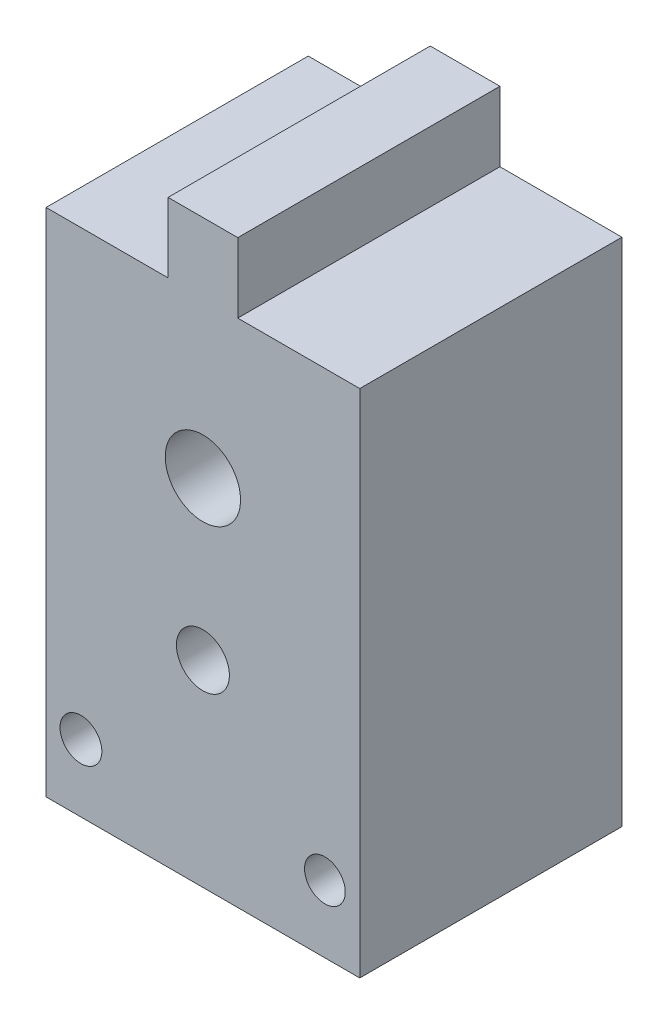
ISO-10303-21;
HEADER;
FILE_DESCRIPTION(('STEP AP214'),'2;1');
FILE_NAME('part.step','',(''),(''),'','','');
FILE_SCHEMA(('AUTOMOTIVE_DESIGN { 1 0 10303 214 1 1 1 1 }'));
ENDSEC;
DATA;
#1=APPLICATION_CONTEXT('core data for automotive mechanical design processes');
#2=APPLICATION_PROTOCOL_DEFINITION('international standard','automotive_design',2000,#1);
#3=PRODUCT_CONTEXT('',#1,'mechanical');
#4=PRODUCT('Part','Part','',(#3));
#5=PRODUCT_RELATED_PRODUCT_CATEGORY('part','',(#4));
#6=PRODUCT_DEFINITION_FORMATION('','',#4);
#7=PRODUCT_DEFINITION_CONTEXT('part definition',#1,'design');
#8=PRODUCT_DEFINITION('design','',#6,#7);
#9=PRODUCT_DEFINITION_SHAPE('','',#8);
#10=(LENGTH_UNIT() NAMED_UNIT(*) SI_UNIT(.MILLI.,.METRE.));
#11=(NAMED_UNIT(*) PLANE_ANGLE_UNIT() SI_UNIT($,.RADIAN.));
#12=(NAMED_UNIT(*) SI_UNIT($,.STERADIAN.) SOLID_ANGLE_UNIT());
#13=UNCERTAINTY_MEASURE_WITH_UNIT(LENGTH_MEASURE(1.E-05),#10,'distance_accuracy_value','');
#14=(GEOMETRIC_REPRESENTATION_CONTEXT(3) GLOBAL_UNCERTAINTY_ASSIGNED_CONTEXT((#13)) GLOBAL_UNIT_ASSIGNED_CONTEXT((#10,
#11,#12)) REPRESENTATION_CONTEXT('',''));
#15=CARTESIAN_POINT('',(0.,0.,0.));
#16=DIRECTION('',(0.,0.,1.));
#17=DIRECTION('',(1.,0.,0.));
#18=AXIS2_PLACEMENT_3D('',#15,#16,#17);
#19=CARTESIAN_POINT('',(0.,0.,9.3865));
#20=DIRECTION('',(0.,0.,-1.));
#21=DIRECTION('',(-1.,0.,0.));
#22=AXIS2_PLACEMENT_3D('',#19,#20,#21);
#23=PLANE('',#22);
#24=DIRECTION('',(0.,-1.,0.));
#25=VECTOR('',#24,1.);
#26=CARTESIAN_POINT('',(-2.49571428571429,20.7724059204904,9.3865));
#27=LINE('',#26,#25);
#28=CARTESIAN_POINT('',(-2.49571428571429,20.7724059204904,9.3865));
#29=VERTEX_POINT('',#28);
#30=CARTESIAN_POINT('',(-2.49571428571429,15.7809773490619,9.3865));
#31=VERTEX_POINT('',#30);
#32=EDGE_CURVE('E145',#29,#31,#27,.T.);
#33=ORIENTED_EDGE('',*,*,#32,.T.);
#34=DIRECTION('',(-1.,0.,0.));
#35=VECTOR('',#34,1.);
#36=CARTESIAN_POINT('',(-2.49571428571429,15.7809773490619,9.3865));
#37=LINE('',#36,#35);
#38=CARTESIAN_POINT('',(-11.2307142857143,15.7809773490619,9.3865));
#39=VERTEX_POINT('',#38);
#40=EDGE_CURVE('E93',#31,#39,#37,.T.);
#41=ORIENTED_EDGE('',*,*,#40,.T.);
#42=DIRECTION('',(0.,-1.,0.));
#43=VECTOR('',#42,1.);
#44=CARTESIAN_POINT('',(-11.2307142857143,15.7809773490619,9.3865));
#45=LINE('',#44,#43);
#46=CARTESIAN_POINT('',(-11.2307142857143,-20.7724059204904,9.3865));
#47=VERTEX_POINT('',#46);
#48=EDGE_CURVE('E160',#39,#47,#45,.T.);
#49=ORIENTED_EDGE('',*,*,#48,.T.);
#50=DIRECTION('',(1.,0.,0.));
#51=VECTOR('',#50,1.);
#52=CARTESIAN_POINT('',(-11.2307142857143,-20.7724059204904,9.3865));
#53=LINE('',#52,#51);
#54=CARTESIAN_POINT('',(11.2307142857143,-20.7724059204904,9.3865));
#55=VERTEX_POINT('',#54);
#56=EDGE_CURVE('E173',#47,#55,#53,.T.);
#57=ORIENTED_EDGE('',*,*,#56,.T.);
#58=DIRECTION('',(0.,1.,0.));
#59=VECTOR('',#58,1.);
#60=CARTESIAN_POINT('',(11.2307142857143,-20.7724059204904,9.3865));
#61=LINE('',#60,#59);
#62=CARTESIAN_POINT('',(11.2307142857143,15.7809773490619,9.3865));
#63=VERTEX_POINT('',#62);
#64=EDGE_CURVE('E112',#55,#63,#61,.T.);
#65=ORIENTED_EDGE('',*,*,#64,.T.);
#66=DIRECTION('',(-1.,0.,0.));
#67=VECTOR('',#66,1.);
#68=CARTESIAN_POINT('',(11.2307142857143,15.7809773490619,9.3865));
#69=LINE('',#68,#67);
#70=CARTESIAN_POINT('',(2.49571428571429,15.7809773490619,9.3865));
#71=VERTEX_POINT('',#70);
#72=EDGE_CURVE('E106',#63,#71,#69,.T.);
#73=ORIENTED_EDGE('',*,*,#72,.T.);
#74=DIRECTION('',(0.,1.,0.));
#75=VECTOR('',#74,1.);
#76=CARTESIAN_POINT('',(2.49571428571429,15.7809773490619,9.3865));
#77=LINE('',#76,#75);
#78=CARTESIAN_POINT('',(2.49571428571429,20.7724059204904,9.3865));
#79=VERTEX_POINT('',#78);
#80=EDGE_CURVE('E110',#71,#79,#77,.T.);
#81=ORIENTED_EDGE('',*,*,#80,.T.);
#82=DIRECTION('',(-1.,0.,0.));
#83=VECTOR('',#82,1.);
#84=CARTESIAN_POINT('',(2.49571428571429,20.7724059204904,9.3865));
#85=LINE('',#84,#83);
#86=EDGE_CURVE('E50',#79,#29,#85,.T.);
#87=ORIENTED_EDGE('',*,*,#86,.T.);
#88=EDGE_LOOP('',(#33,#41,#49,#57,#65,#73,#81,#87));
#89=FACE_BOUND('',#88,.T.);
#90=CARTESIAN_POINT('',(0.,-6.68045122236669,9.3865));
#91=DIRECTION('',(0.,0.,1.));
#92=DIRECTION('',(1.,0.,0.));
#93=AXIS2_PLACEMENT_3D('',#90,#91,#92);
#94=CIRCLE('',#93,1.89674285714286);
#95=CARTESIAN_POINT('',(-1.89674285714286,-6.68045122236669,9.3865));
#96=VERTEX_POINT('',#95);
#97=EDGE_CURVE('E134',#96,#96,#94,.T.);
#98=ORIENTED_EDGE('',*,*,#97,.F.);
#99=EDGE_LOOP('',(#98));
#100=FACE_BOUND('',#99,.T.);
#101=CARTESIAN_POINT('',(8.735,-15.9645083652238,9.3865));
#102=DIRECTION('',(0.,0.,1.));
#103=DIRECTION('',(1.,0.,0.));
#104=AXIS2_PLACEMENT_3D('',#101,#102,#103);
#105=CIRCLE('',#104,1.45833049041743);
#106=CARTESIAN_POINT('',(7.27666950958257,-15.9645083652238,9.3865));
#107=VERTEX_POINT('',#106);
#108=EDGE_CURVE('E182',#107,#107,#105,.T.);
#109=ORIENTED_EDGE('',*,*,#108,.F.);
#110=EDGE_LOOP('',(#109));
#111=FACE_BOUND('',#110,.T.);
#112=CARTESIAN_POINT('',(-8.735,-15.9645083652238,9.3865));
#113=DIRECTION('',(0.,0.,1.));
#114=DIRECTION('',(1.,0.,0.));
#115=AXIS2_PLACEMENT_3D('',#112,#113,#114);
#116=CIRCLE('',#115,1.49742857142857);
#117=CARTESIAN_POINT('',(-10.2324285714286,-15.9645083652238,9.3865));
#118=VERTEX_POINT('',#117);
#119=EDGE_CURVE('E188',#118,#118,#116,.T.);
#120=ORIENTED_EDGE('',*,*,#119,.F.);
#121=EDGE_LOOP('',(#120));
#122=FACE_BOUND('',#121,.T.);
#123=CARTESIAN_POINT('',(0.,4.60017734906188,9.3865));
#124=DIRECTION('',(0.,0.,1.));
#125=DIRECTION('',(1.,0.,0.));
#126=AXIS2_PLACEMENT_3D('',#123,#124,#125);
#127=CIRCLE('',#126,2.69537142857143);
#128=CARTESIAN_POINT('',(-2.69537142857143,4.60017734906188,9.3865));
#129=VERTEX_POINT('',#128);
#130=EDGE_CURVE('E194',#129,#129,#127,.T.);
#131=ORIENTED_EDGE('',*,*,#130,.F.);
#132=EDGE_LOOP('',(#131));
#133=FACE_BOUND('',#132,.T.);
#134=ADVANCED_FACE('F33',(#89,#100,#111,#122,#133),#23,.F.);
#135=CARTESIAN_POINT('',(0.,0.,-9.3865));
#136=DIRECTION('',(0.,0.,-1.));
#137=DIRECTION('',(-1.,0.,0.));
#138=AXIS2_PLACEMENT_3D('',#135,#136,#137);
#139=PLANE('',#138);
#140=CARTESIAN_POINT('',(-8.735,-15.9645083652238,-9.3865));
#141=DIRECTION('',(0.,0.,1.));
#142=DIRECTION('',(1.,0.,0.));
#143=AXIS2_PLACEMENT_3D('',#140,#141,#142);
#144=CIRCLE('',#143,1.49742857142857);
#145=CARTESIAN_POINT('',(-10.2324285714286,-15.9645083652238,-9.3865));
#146=VERTEX_POINT('',#145);
#147=EDGE_CURVE('E191',#146,#146,#144,.T.);
#148=ORIENTED_EDGE('',*,*,#147,.T.);
#149=EDGE_LOOP('',(#148));
#150=FACE_BOUND('',#149,.T.);
#151=CARTESIAN_POINT('',(0.,-6.68045122236669,-9.3865));
#152=DIRECTION('',(0.,0.,1.));
#153=DIRECTION('',(1.,0.,0.));
#154=AXIS2_PLACEMENT_3D('',#151,#152,#153);
#155=CIRCLE('',#154,1.89674285714286);
#156=CARTESIAN_POINT('',(-1.89674285714286,-6.68045122236669,-9.3865));
#157=VERTEX_POINT('',#156);
#158=EDGE_CURVE('E179',#157,#157,#155,.T.);
#159=ORIENTED_EDGE('',*,*,#158,.T.);
#160=EDGE_LOOP('',(#159));
#161=FACE_BOUND('',#160,.T.);
#162=DIRECTION('',(0.,-1.,0.));
#163=VECTOR('',#162,1.);
#164=CARTESIAN_POINT('',(-2.49571428571429,20.7724059204904,-9.3865));
#165=LINE('',#164,#163);
#166=CARTESIAN_POINT('',(-2.49571428571429,20.7724059204904,-9.3865));
#167=VERTEX_POINT('',#166);
#168=CARTESIAN_POINT('',(-2.49571428571429,15.7809773490619,-9.3865));
#169=VERTEX_POINT('',#168);
#170=EDGE_CURVE('E130',#167,#169,#165,.T.);
#171=ORIENTED_EDGE('',*,*,#170,.F.);
#172=DIRECTION('',(-1.,0.,0.));
#173=VECTOR('',#172,1.);
#174=CARTESIAN_POINT('',(2.49571428571429,20.7724059204904,-9.3865));
#175=LINE('',#174,#173);
#176=CARTESIAN_POINT('',(2.49571428571429,20.7724059204904,-9.3865));
#177=VERTEX_POINT('',#176);
#178=EDGE_CURVE('E85',#177,#167,#175,.T.);
#179=ORIENTED_EDGE('',*,*,#178,.F.);
#180=DIRECTION('',(0.,1.,0.));
#181=VECTOR('',#180,1.);
#182=CARTESIAN_POINT('',(2.49571428571429,15.7809773490619,-9.3865));
#183=LINE('',#182,#181);
#184=CARTESIAN_POINT('',(2.49571428571429,15.7809773490619,-9.3865));
#185=VERTEX_POINT('',#184);
#186=EDGE_CURVE('E79',#185,#177,#183,.T.);
#187=ORIENTED_EDGE('',*,*,#186,.F.);
#188=DIRECTION('',(-1.,0.,0.));
#189=VECTOR('',#188,1.);
#190=CARTESIAN_POINT('',(11.2307142857143,15.7809773490619,-9.3865));
#191=LINE('',#190,#189);
#192=CARTESIAN_POINT('',(11.2307142857143,15.7809773490619,-9.3865));
#193=VERTEX_POINT('',#192);
#194=EDGE_CURVE('E120',#193,#185,#191,.T.);
#195=ORIENTED_EDGE('',*,*,#194,.F.);
#196=DIRECTION('',(0.,1.,0.));
#197=VECTOR('',#196,1.);
#198=CARTESIAN_POINT('',(11.2307142857143,-20.7724059204904,-9.3865));
#199=LINE('',#198,#197);
#200=CARTESIAN_POINT('',(11.2307142857143,-20.7724059204904,-9.3865));
#201=VERTEX_POINT('',#200);
#202=EDGE_CURVE('E140',#201,#193,#199,.T.);
#203=ORIENTED_EDGE('',*,*,#202,.F.);
#204=DIRECTION('',(1.,0.,0.));
#205=VECTOR('',#204,1.);
#206=CARTESIAN_POINT('',(-11.2307142857143,-20.7724059204904,-9.3865));
#207=LINE('',#206,#205);
#208=CARTESIAN_POINT('',(-11.2307142857143,-20.7724059204904,-9.3865));
#209=VERTEX_POINT('',#208);
#210=EDGE_CURVE('E138',#209,#201,#207,.T.);
#211=ORIENTED_EDGE('',*,*,#210,.F.);
#212=DIRECTION('',(0.,-1.,0.));
#213=VECTOR('',#212,1.);
#214=CARTESIAN_POINT('',(-11.2307142857143,15.7809773490619,-9.3865));
#215=LINE('',#214,#213);
#216=CARTESIAN_POINT('',(-11.2307142857143,15.7809773490619,-9.3865));
#217=VERTEX_POINT('',#216);
#218=EDGE_CURVE('E136',#217,#209,#215,.T.);
#219=ORIENTED_EDGE('',*,*,#218,.F.);
#220=DIRECTION('',(-1.,0.,0.));
#221=VECTOR('',#220,1.);
#222=CARTESIAN_POINT('',(-2.49571428571429,15.7809773490619,-9.3865));
#223=LINE('',#222,#221);
#224=EDGE_CURVE('E133',#169,#217,#223,.T.);
#225=ORIENTED_EDGE('',*,*,#224,.F.);
#226=EDGE_LOOP('',(#171,#179,#187,#195,#203,#211,#219,#225));
#227=FACE_BOUND('',#226,.T.);
#228=CARTESIAN_POINT('',(8.735,-15.9645083652238,-9.3865));
#229=DIRECTION('',(0.,0.,1.));
#230=DIRECTION('',(1.,0.,0.));
#231=AXIS2_PLACEMENT_3D('',#228,#229,#230);
#232=CIRCLE('',#231,1.45833049041743);
#233=CARTESIAN_POINT('',(7.27666950958257,-15.9645083652238,-9.3865));
#234=VERTEX_POINT('',#233);
#235=EDGE_CURVE('E185',#234,#234,#232,.T.);
#236=ORIENTED_EDGE('',*,*,#235,.T.);
#237=EDGE_LOOP('',(#236));
#238=FACE_BOUND('',#237,.T.);
#239=CARTESIAN_POINT('',(0.,4.60017734906188,-9.3865));
#240=DIRECTION('',(0.,0.,1.));
#241=DIRECTION('',(1.,0.,0.));
#242=AXIS2_PLACEMENT_3D('',#239,#240,#241);
#243=CIRCLE('',#242,2.69537142857143);
#244=CARTESIAN_POINT('',(-2.69537142857143,4.60017734906188,-9.3865));
#245=VERTEX_POINT('',#244);
#246=EDGE_CURVE('E197',#245,#245,#243,.T.);
#247=ORIENTED_EDGE('',*,*,#246,.T.);
#248=EDGE_LOOP('',(#247));
#249=FACE_BOUND('',#248,.T.);
#250=ADVANCED_FACE('F164',(#150,#161,#227,#238,#249),#139,.T.);
#251=CARTESIAN_POINT('',(-2.49571428571429,20.7724059204904,9.3865));
#252=DIRECTION('',(1.,0.,0.));
#253=DIRECTION('',(0.,0.,-1.));
#254=AXIS2_PLACEMENT_3D('',#251,#252,#253);
#255=PLANE('',#254);
#256=ORIENTED_EDGE('',*,*,#170,.T.);
#257=DIRECTION('',(0.,0.,-1.));
#258=VECTOR('',#257,1.);
#259=CARTESIAN_POINT('',(-2.49571428571429,15.7809773490619,9.3865));
#260=LINE('',#259,#258);
#261=EDGE_CURVE('E11',#31,#169,#260,.T.);
#262=ORIENTED_EDGE('',*,*,#261,.F.);
#263=ORIENTED_EDGE('',*,*,#32,.F.);
#264=DIRECTION('',(0.,0.,-1.));
#265=VECTOR('',#264,1.);
#266=CARTESIAN_POINT('',(-2.49571428571429,20.7724059204904,9.3865));
#267=LINE('',#266,#265);
#268=EDGE_CURVE('E126',#29,#167,#267,.T.);
#269=ORIENTED_EDGE('',*,*,#268,.T.);
#270=EDGE_LOOP('',(#256,#262,#263,#269));
#271=FACE_BOUND('',#270,.T.);
#272=ADVANCED_FACE('F35',(#271),#255,.F.);
#273=CARTESIAN_POINT('',(-2.49571428571429,15.7809773490619,9.3865));
#274=DIRECTION('',(0.,-1.,0.));
#275=DIRECTION('',(1.,0.,0.));
#276=AXIS2_PLACEMENT_3D('',#273,#274,#275);
#277=PLANE('',#276);
#278=ORIENTED_EDGE('',*,*,#224,.T.);
#279=DIRECTION('',(0.,0.,-1.));
#280=VECTOR('',#279,1.);
#281=CARTESIAN_POINT('',(-11.2307142857143,15.7809773490619,9.3865));
#282=LINE('',#281,#280);
#283=EDGE_CURVE('E42',#39,#217,#282,.T.);
#284=ORIENTED_EDGE('',*,*,#283,.F.);
#285=ORIENTED_EDGE('',*,*,#40,.F.);
#286=ORIENTED_EDGE('',*,*,#261,.T.);
#287=EDGE_LOOP('',(#278,#284,#285,#286));
#288=FACE_BOUND('',#287,.T.);
#289=ADVANCED_FACE('F229',(#288),#277,.F.);
#290=CARTESIAN_POINT('',(-11.2307142857143,15.7809773490619,9.3865));
#291=DIRECTION('',(1.,0.,0.));
#292=DIRECTION('',(0.,1.,0.));
#293=AXIS2_PLACEMENT_3D('',#290,#291,#292);
#294=PLANE('',#293);
#295=ORIENTED_EDGE('',*,*,#218,.T.);
#296=DIRECTION('',(0.,0.,-1.));
#297=VECTOR('',#296,1.);
#298=CARTESIAN_POINT('',(-11.2307142857143,-20.7724059204904,9.3865));
#299=LINE('',#298,#297);
#300=EDGE_CURVE('E152',#47,#209,#299,.T.);
#301=ORIENTED_EDGE('',*,*,#300,.F.);
#302=ORIENTED_EDGE('',*,*,#48,.F.);
#303=ORIENTED_EDGE('',*,*,#283,.T.);
#304=EDGE_LOOP('',(#295,#301,#302,#303));
#305=FACE_BOUND('',#304,.T.);
#306=ADVANCED_FACE('F158',(#305),#294,.F.);
#307=CARTESIAN_POINT('',(-11.2307142857143,-20.7724059204904,9.3865));
#308=DIRECTION('',(0.,1.,0.));
#309=DIRECTION('',(0.,0.,1.));
#310=AXIS2_PLACEMENT_3D('',#307,#308,#309);
#311=PLANE('',#310);
#312=ORIENTED_EDGE('',*,*,#210,.T.);
#313=DIRECTION('',(0.,0.,-1.));
#314=VECTOR('',#313,1.);
#315=CARTESIAN_POINT('',(11.2307142857143,-20.7724059204904,9.3865));
#316=LINE('',#315,#314);
#317=EDGE_CURVE('E149',#55,#201,#316,.T.);
#318=ORIENTED_EDGE('',*,*,#317,.F.);
#319=ORIENTED_EDGE('',*,*,#56,.F.);
#320=ORIENTED_EDGE('',*,*,#300,.T.);
#321=EDGE_LOOP('',(#312,#318,#319,#320));
#322=FACE_BOUND('',#321,.T.);
#323=ADVANCED_FACE('F169',(#322),#311,.F.);
#324=CARTESIAN_POINT('',(11.2307142857143,-20.7724059204904,9.3865));
#325=DIRECTION('',(-1.,0.,0.));
#326=DIRECTION('',(0.,0.,1.));
#327=AXIS2_PLACEMENT_3D('',#324,#325,#326);
#328=PLANE('',#327);
#329=ORIENTED_EDGE('',*,*,#202,.T.);
#330=DIRECTION('',(0.,0.,-1.));
#331=VECTOR('',#330,1.);
#332=CARTESIAN_POINT('',(11.2307142857143,15.7809773490619,9.3865));
#333=LINE('',#332,#331);
#334=EDGE_CURVE('E121',#63,#193,#333,.T.);
#335=ORIENTED_EDGE('',*,*,#334,.F.);
#336=ORIENTED_EDGE('',*,*,#64,.F.);
#337=ORIENTED_EDGE('',*,*,#317,.T.);
#338=EDGE_LOOP('',(#329,#335,#336,#337));
#339=FACE_BOUND('',#338,.T.);
#340=ADVANCED_FACE('F172',(#339),#328,.F.);
#341=CARTESIAN_POINT('',(11.2307142857143,15.7809773490619,9.3865));
#342=DIRECTION('',(0.,-1.,0.));
#343=DIRECTION('',(0.,0.,-1.));
#344=AXIS2_PLACEMENT_3D('',#341,#342,#343);
#345=PLANE('',#344);
#346=ORIENTED_EDGE('',*,*,#194,.T.);
#347=DIRECTION('',(0.,0.,-1.));
#348=VECTOR('',#347,1.);
#349=CARTESIAN_POINT('',(2.49571428571429,15.7809773490619,9.3865));
#350=LINE('',#349,#348);
#351=EDGE_CURVE('E117',#71,#185,#350,.T.);
#352=ORIENTED_EDGE('',*,*,#351,.F.);
#353=ORIENTED_EDGE('',*,*,#72,.F.);
#354=ORIENTED_EDGE('',*,*,#334,.T.);
#355=EDGE_LOOP('',(#346,#352,#353,#354));
#356=FACE_BOUND('',#355,.T.);
#357=ADVANCED_FACE('F118',(#356),#345,.F.);
#358=CARTESIAN_POINT('',(2.49571428571429,15.7809773490619,9.3865));
#359=DIRECTION('',(-1.,0.,0.));
#360=DIRECTION('',(0.,0.,1.));
#361=AXIS2_PLACEMENT_3D('',#358,#359,#360);
#362=PLANE('',#361);
#363=ORIENTED_EDGE('',*,*,#186,.T.);
#364=DIRECTION('',(0.,0.,-1.));
#365=VECTOR('',#364,1.);
#366=CARTESIAN_POINT('',(2.49571428571429,20.7724059204904,9.3865));
#367=LINE('',#366,#365);
#368=EDGE_CURVE('E122',#79,#177,#367,.T.);
#369=ORIENTED_EDGE('',*,*,#368,.F.);
#370=ORIENTED_EDGE('',*,*,#80,.F.);
#371=ORIENTED_EDGE('',*,*,#351,.T.);
#372=EDGE_LOOP('',(#363,#369,#370,#371));
#373=FACE_BOUND('',#372,.T.);
#374=ADVANCED_FACE('F124',(#373),#362,.F.);
#375=CARTESIAN_POINT('',(2.49571428571429,20.7724059204904,9.3865));
#376=DIRECTION('',(0.,-1.,0.));
#377=DIRECTION('',(0.,0.,-1.));
#378=AXIS2_PLACEMENT_3D('',#375,#376,#377);
#379=PLANE('',#378);
#380=ORIENTED_EDGE('',*,*,#178,.T.);
#381=ORIENTED_EDGE('',*,*,#268,.F.);
#382=ORIENTED_EDGE('',*,*,#86,.F.);
#383=ORIENTED_EDGE('',*,*,#368,.T.);
#384=EDGE_LOOP('',(#380,#381,#382,#383));
#385=FACE_BOUND('',#384,.T.);
#386=ADVANCED_FACE('F217',(#385),#379,.F.);
#387=CARTESIAN_POINT('',(0.,-6.68045122236669,9.3865));
#388=DIRECTION('',(0.,0.,-1.));
#389=DIRECTION('',(-1.,0.,0.));
#390=AXIS2_PLACEMENT_3D('',#387,#388,#389);
#391=CYLINDRICAL_SURFACE('',#390,1.89674285714286);
#392=CARTESIAN_POINT('',(-1.89674285714286,-6.68045122236669,9.3865));
#393=CARTESIAN_POINT('',(-1.89674285714286,-6.68045122236669,9.19094791666667));
#394=CARTESIAN_POINT('',(-1.89674285714286,-6.68045122236669,8.99539583333333));
#395=CARTESIAN_POINT('',(-1.89674285714286,-6.68045122236669,8.60429166666666));
#396=CARTESIAN_POINT('',(-1.89674285714286,-6.68045122236669,8.40873958333333));
#397=CARTESIAN_POINT('',(-1.89674285714286,-6.68045122236669,8.01763541666667));
#398=CARTESIAN_POINT('',(-1.89674285714286,-6.68045122236669,7.82208333333333));
#399=CARTESIAN_POINT('',(-1.89674285714286,-6.68045122236669,7.43097916666667));
#400=CARTESIAN_POINT('',(-1.89674285714286,-6.68045122236669,7.23542708333333));
#401=CARTESIAN_POINT('',(-1.89674285714286,-6.68045122236669,6.84432291666666));
#402=CARTESIAN_POINT('',(-1.89674285714286,-6.68045122236669,6.64877083333333));
#403=CARTESIAN_POINT('',(-1.89674285714286,-6.68045122236669,6.25766666666666));
#404=CARTESIAN_POINT('',(-1.89674285714286,-6.68045122236669,6.06211458333333));
#405=CARTESIAN_POINT('',(-1.89674285714286,-6.68045122236669,5.67101041666666));
#406=CARTESIAN_POINT('',(-1.89674285714286,-6.68045122236669,5.47545833333333));
#407=CARTESIAN_POINT('',(-1.89674285714286,-6.68045122236669,5.08435416666666));
#408=CARTESIAN_POINT('',(-1.89674285714286,-6.68045122236669,4.88880208333333));
#409=CARTESIAN_POINT('',(-1.89674285714286,-6.68045122236669,4.49769791666666));
#410=CARTESIAN_POINT('',(-1.89674285714286,-6.68045122236669,4.30214583333333));
#411=CARTESIAN_POINT('',(-1.89674285714286,-6.68045122236669,3.91104166666666));
#412=CARTESIAN_POINT('',(-1.89674285714286,-6.68045122236669,3.71548958333333));
#413=CARTESIAN_POINT('',(-1.89674285714286,-6.68045122236669,3.32438541666666));
#414=CARTESIAN_POINT('',(-1.89674285714286,-6.68045122236669,3.12883333333333));
#415=CARTESIAN_POINT('',(-1.89674285714286,-6.68045122236669,2.73772916666666));
#416=CARTESIAN_POINT('',(-1.89674285714286,-6.68045122236669,2.54217708333333));
#417=CARTESIAN_POINT('',(-1.89674285714286,-6.68045122236669,2.15107291666666));
#418=CARTESIAN_POINT('',(-1.89674285714286,-6.68045122236669,1.95552083333333));
#419=CARTESIAN_POINT('',(-1.89674285714286,-6.68045122236669,1.56441666666666));
#420=CARTESIAN_POINT('',(-1.89674285714286,-6.68045122236669,1.36886458333333));
#421=CARTESIAN_POINT('',(-1.89674285714286,-6.68045122236669,0.977760416666665));
#422=CARTESIAN_POINT('',(-1.89674285714286,-6.68045122236669,0.782208333333332));
#423=CARTESIAN_POINT('',(-1.89674285714286,-6.68045122236669,0.391104166666665));
#424=CARTESIAN_POINT('',(-1.89674285714286,-6.68045122236669,0.195552083333331));
#425=CARTESIAN_POINT('',(-1.89674285714286,-6.68045122236669,-0.195552083333335));
#426=CARTESIAN_POINT('',(-1.89674285714286,-6.68045122236669,-0.391104166666668));
#427=CARTESIAN_POINT('',(-1.89674285714286,-6.68045122236669,-0.782208333333335));
#428=CARTESIAN_POINT('',(-1.89674285714286,-6.68045122236669,-0.977760416666669));
#429=CARTESIAN_POINT('',(-1.89674285714286,-6.68045122236669,-1.36886458333334));
#430=CARTESIAN_POINT('',(-1.89674285714286,-6.68045122236669,-1.56441666666667));
#431=CARTESIAN_POINT('',(-1.89674285714286,-6.68045122236669,-1.95552083333334));
#432=CARTESIAN_POINT('',(-1.89674285714286,-6.68045122236669,-2.15107291666667));
#433=CARTESIAN_POINT('',(-1.89674285714286,-6.68045122236669,-2.54217708333334));
#434=CARTESIAN_POINT('',(-1.89674285714286,-6.68045122236669,-2.73772916666667));
#435=CARTESIAN_POINT('',(-1.89674285714286,-6.68045122236669,-3.12883333333334));
#436=CARTESIAN_POINT('',(-1.89674285714286,-6.68045122236669,-3.32438541666667));
#437=CARTESIAN_POINT('',(-1.89674285714286,-6.68045122236669,-3.71548958333334));
#438=CARTESIAN_POINT('',(-1.89674285714286,-6.68045122236669,-3.91104166666667));
#439=CARTESIAN_POINT('',(-1.89674285714286,-6.68045122236669,-4.30214583333334));
#440=CARTESIAN_POINT('',(-1.89674285714286,-6.68045122236669,-4.49769791666667));
#441=CARTESIAN_POINT('',(-1.89674285714286,-6.68045122236669,-4.88880208333334));
#442=CARTESIAN_POINT('',(-1.89674285714286,-6.68045122236669,-5.08435416666667));
#443=CARTESIAN_POINT('',(-1.89674285714286,-6.68045122236669,-5.47545833333334));
#444=CARTESIAN_POINT('',(-1.89674285714286,-6.68045122236669,-5.67101041666667));
#445=CARTESIAN_POINT('',(-1.89674285714286,-6.68045122236669,-6.06211458333334));
#446=CARTESIAN_POINT('',(-1.89674285714286,-6.68045122236669,-6.25766666666667));
#447=CARTESIAN_POINT('',(-1.89674285714286,-6.68045122236669,-6.64877083333334));
#448=CARTESIAN_POINT('',(-1.89674285714286,-6.68045122236669,-6.84432291666667));
#449=CARTESIAN_POINT('',(-1.89674285714286,-6.68045122236669,-7.23542708333334));
#450=CARTESIAN_POINT('',(-1.89674285714286,-6.68045122236669,-7.43097916666667));
#451=CARTESIAN_POINT('',(-1.89674285714286,-6.68045122236669,-7.82208333333334));
#452=CARTESIAN_POINT('',(-1.89674285714286,-6.68045122236669,-8.01763541666667));
#453=CARTESIAN_POINT('',(-1.89674285714286,-6.68045122236669,-8.40873958333334));
#454=CARTESIAN_POINT('',(-1.89674285714286,-6.68045122236669,-8.60429166666667));
#455=CARTESIAN_POINT('',(-1.89674285714286,-6.68045122236669,-8.99539583333334));
#456=CARTESIAN_POINT('',(-1.89674285714286,-6.68045122236669,-9.19094791666667));
#457=CARTESIAN_POINT('',(-1.89674285714286,-6.68045122236669,-9.3865));
#458=B_SPLINE_CURVE_WITH_KNOTS('',3,(#392,#393,#394,#395,#396,#397,#398,#399,#400,#401,#402,
#403,#404,#405,#406,#407,#408,#409,#410,#411,#412,#413,#414,#415,#416,#417,#418,#419,#420,#421,
#422,#423,#424,#425,#426,#427,#428,#429,#430,#431,#432,#433,#434,#435,#436,#437,#438,#439,#440,
#441,#442,#443,#444,#445,#446,#447,#448,#449,#450,#451,#452,#453,#454,#455,#456,#457),
.UNSPECIFIED.,.F.,.F.,(4,2,2,2,2,2,2,2,2,2,2,2,2,2,2,2,2,2,2,2,2,2,2,2,2,2,2,2,2,2,2,2,4),(0.,
0.586656250000001,1.1733125,1.75996875,2.346625,2.93328125,3.5199375,4.10659375,4.69325,
5.27990625,5.8665625,6.45321875,7.039875,7.62653125,8.2131875,8.79984375,9.3865,9.97315625,
10.5598125,11.14646875,11.733125,12.31978125,12.9064375,13.49309375,14.07975,14.66640625,
15.2530625,15.83971875,16.426375,17.01303125,17.5996875,18.18634375,18.773),.UNSPECIFIED.);
#459=EDGE_CURVE('BSEAM214',#96,#157,#458,.T.);
#460=ORIENTED_EDGE('',*,*,#97,.T.);
#461=ORIENTED_EDGE('',*,*,#158,.F.);
#462=ORIENTED_EDGE('',*,*,#459,.T.);
#463=ORIENTED_EDGE('',*,*,#459,.F.);
#464=EDGE_LOOP('',(#460,#462,#461,#463));
#465=FACE_BOUND('',#464,.T.);
#466=ADVANCED_FACE('F214',(#465),#391,.F.);
#467=CARTESIAN_POINT('',(8.735,-15.9645083652238,9.3865));
#468=DIRECTION('',(0.,0.,-1.));
#469=DIRECTION('',(-1.,0.,0.));
#470=AXIS2_PLACEMENT_3D('',#467,#468,#469);
#471=CYLINDRICAL_SURFACE('',#470,1.45833049041743);
#472=CARTESIAN_POINT('',(7.27666950958257,-15.9645083652238,9.3865));
#473=CARTESIAN_POINT('',(7.27666950958257,-15.9645083652238,9.19094791666666));
#474=CARTESIAN_POINT('',(7.27666950958257,-15.9645083652238,8.99539583333333));
#475=CARTESIAN_POINT('',(7.27666950958257,-15.9645083652238,8.60429166666666));
#476=CARTESIAN_POINT('',(7.27666950958257,-15.9645083652238,8.40873958333333));
#477=CARTESIAN_POINT('',(7.27666950958257,-15.9645083652238,8.01763541666667));
#478=CARTESIAN_POINT('',(7.27666950958257,-15.9645083652238,7.82208333333333));
#479=CARTESIAN_POINT('',(7.27666950958257,-15.9645083652238,7.43097916666667));
#480=CARTESIAN_POINT('',(7.27666950958257,-15.9645083652238,7.23542708333333));
#481=CARTESIAN_POINT('',(7.27666950958257,-15.9645083652238,6.84432291666666));
#482=CARTESIAN_POINT('',(7.27666950958257,-15.9645083652238,6.64877083333333));
#483=CARTESIAN_POINT('',(7.27666950958257,-15.9645083652238,6.25766666666666));
#484=CARTESIAN_POINT('',(7.27666950958257,-15.9645083652238,6.06211458333333));
#485=CARTESIAN_POINT('',(7.27666950958257,-15.9645083652238,5.67101041666666));
#486=CARTESIAN_POINT('',(7.27666950958257,-15.9645083652238,5.47545833333333));
#487=CARTESIAN_POINT('',(7.27666950958257,-15.9645083652238,5.08435416666666));
#488=CARTESIAN_POINT('',(7.27666950958257,-15.9645083652238,4.88880208333333));
#489=CARTESIAN_POINT('',(7.27666950958257,-15.9645083652238,4.49769791666666));
#490=CARTESIAN_POINT('',(7.27666950958257,-15.9645083652238,4.30214583333333));
#491=CARTESIAN_POINT('',(7.27666950958257,-15.9645083652238,3.91104166666666));
#492=CARTESIAN_POINT('',(7.27666950958257,-15.9645083652238,3.71548958333333));
#493=CARTESIAN_POINT('',(7.27666950958257,-15.9645083652238,3.32438541666666));
#494=CARTESIAN_POINT('',(7.27666950958257,-15.9645083652238,3.12883333333333));
#495=CARTESIAN_POINT('',(7.27666950958257,-15.9645083652238,2.73772916666666));
#496=CARTESIAN_POINT('',(7.27666950958257,-15.9645083652238,2.54217708333333));
#497=CARTESIAN_POINT('',(7.27666950958257,-15.9645083652238,2.15107291666666));
#498=CARTESIAN_POINT('',(7.27666950958257,-15.9645083652238,1.95552083333333));
#499=CARTESIAN_POINT('',(7.27666950958257,-15.9645083652238,1.56441666666666));
#500=CARTESIAN_POINT('',(7.27666950958257,-15.9645083652238,1.36886458333333));
#501=CARTESIAN_POINT('',(7.27666950958257,-15.9645083652238,0.977760416666663));
#502=CARTESIAN_POINT('',(7.27666950958257,-15.9645083652238,0.78220833333333));
#503=CARTESIAN_POINT('',(7.27666950958257,-15.9645083652238,0.391104166666663));
#504=CARTESIAN_POINT('',(7.27666950958257,-15.9645083652238,0.19555208333333));
#505=CARTESIAN_POINT('',(7.27666950958257,-15.9645083652238,-0.195552083333337));
#506=CARTESIAN_POINT('',(7.27666950958257,-15.9645083652238,-0.39110416666667));
#507=CARTESIAN_POINT('',(7.27666950958257,-15.9645083652238,-0.782208333333337));
#508=CARTESIAN_POINT('',(7.27666950958257,-15.9645083652238,-0.97776041666667));
#509=CARTESIAN_POINT('',(7.27666950958257,-15.9645083652238,-1.36886458333334));
#510=CARTESIAN_POINT('',(7.27666950958257,-15.9645083652238,-1.56441666666667));
#511=CARTESIAN_POINT('',(7.27666950958257,-15.9645083652238,-1.95552083333334));
#512=CARTESIAN_POINT('',(7.27666950958257,-15.9645083652238,-2.15107291666667));
#513=CARTESIAN_POINT('',(7.27666950958257,-15.9645083652238,-2.54217708333334));
#514=CARTESIAN_POINT('',(7.27666950958257,-15.9645083652238,-2.73772916666667));
#515=CARTESIAN_POINT('',(7.27666950958257,-15.9645083652238,-3.12883333333334));
#516=CARTESIAN_POINT('',(7.27666950958257,-15.9645083652238,-3.32438541666667));
#517=CARTESIAN_POINT('',(7.27666950958257,-15.9645083652238,-3.71548958333334));
#518=CARTESIAN_POINT('',(7.27666950958257,-15.9645083652238,-3.91104166666667));
#519=CARTESIAN_POINT('',(7.27666950958257,-15.9645083652238,-4.30214583333334));
#520=CARTESIAN_POINT('',(7.27666950958257,-15.9645083652238,-4.49769791666667));
#521=CARTESIAN_POINT('',(7.27666950958257,-15.9645083652238,-4.88880208333334));
#522=CARTESIAN_POINT('',(7.27666950958257,-15.9645083652238,-5.08435416666667));
#523=CARTESIAN_POINT('',(7.27666950958257,-15.9645083652238,-5.47545833333334));
#524=CARTESIAN_POINT('',(7.27666950958257,-15.9645083652238,-5.67101041666667));
#525=CARTESIAN_POINT('',(7.27666950958257,-15.9645083652238,-6.06211458333334));
#526=CARTESIAN_POINT('',(7.27666950958257,-15.9645083652238,-6.25766666666667));
#527=CARTESIAN_POINT('',(7.27666950958257,-15.9645083652238,-6.64877083333334));
#528=CARTESIAN_POINT('',(7.27666950958257,-15.9645083652238,-6.84432291666667));
#529=CARTESIAN_POINT('',(7.27666950958257,-15.9645083652238,-7.23542708333334));
#530=CARTESIAN_POINT('',(7.27666950958257,-15.9645083652238,-7.43097916666667));
#531=CARTESIAN_POINT('',(7.27666950958257,-15.9645083652238,-7.82208333333334));
#532=CARTESIAN_POINT('',(7.27666950958257,-15.9645083652238,-8.01763541666667));
#533=CARTESIAN_POINT('',(7.27666950958257,-15.9645083652238,-8.40873958333334));
#534=CARTESIAN_POINT('',(7.27666950958257,-15.9645083652238,-8.60429166666667));
#535=CARTESIAN_POINT('',(7.27666950958257,-15.9645083652238,-8.99539583333334));
#536=CARTESIAN_POINT('',(7.27666950958257,-15.9645083652238,-9.19094791666667));
#537=CARTESIAN_POINT('',(7.27666950958257,-15.9645083652238,-9.3865));
#538=B_SPLINE_CURVE_WITH_KNOTS('',3,(#472,#473,#474,#475,#476,#477,#478,#479,#480,#481,#482,
#483,#484,#485,#486,#487,#488,#489,#490,#491,#492,#493,#494,#495,#496,#497,#498,#499,#500,#501,
#502,#503,#504,#505,#506,#507,#508,#509,#510,#511,#512,#513,#514,#515,#516,#517,#518,#519,#520,
#521,#522,#523,#524,#525,#526,#527,#528,#529,#530,#531,#532,#533,#534,#535,#536,#537),
.UNSPECIFIED.,.F.,.F.,(4,2,2,2,2,2,2,2,2,2,2,2,2,2,2,2,2,2,2,2,2,2,2,2,2,2,2,2,2,2,2,2,4),(0.,
0.58665625,1.1733125,1.75996875,2.346625,2.93328125,3.5199375,4.10659375,4.69325,5.27990625,
5.8665625,6.45321875,7.039875,7.62653125,8.2131875,8.79984375,9.3865,9.97315625,10.5598125,
11.14646875,11.733125,12.31978125,12.9064375,13.49309375,14.07975,14.66640625,15.2530625,
15.83971875,16.426375,17.01303125,17.5996875,18.18634375,18.773),.UNSPECIFIED.);
#539=EDGE_CURVE('BSEAM293',#107,#234,#538,.T.);
#540=ORIENTED_EDGE('',*,*,#108,.T.);
#541=ORIENTED_EDGE('',*,*,#235,.F.);
#542=ORIENTED_EDGE('',*,*,#539,.T.);
#543=ORIENTED_EDGE('',*,*,#539,.F.);
#544=EDGE_LOOP('',(#540,#542,#541,#543));
#545=FACE_BOUND('',#544,.T.);
#546=ADVANCED_FACE('F293',(#545),#471,.F.);
#547=CARTESIAN_POINT('',(-8.735,-15.9645083652238,9.3865));
#548=DIRECTION('',(0.,0.,-1.));
#549=DIRECTION('',(-1.,0.,0.));
#550=AXIS2_PLACEMENT_3D('',#547,#548,#549);
#551=CYLINDRICAL_SURFACE('',#550,1.49742857142857);
#552=CARTESIAN_POINT('',(-10.2324285714286,-15.9645083652238,9.3865));
#553=CARTESIAN_POINT('',(-10.2324285714286,-15.9645083652238,9.19094791666666));
#554=CARTESIAN_POINT('',(-10.2324285714286,-15.9645083652238,8.99539583333333));
#555=CARTESIAN_POINT('',(-10.2324285714286,-15.9645083652238,8.60429166666666));
#556=CARTESIAN_POINT('',(-10.2324285714286,-15.9645083652238,8.40873958333333));
#557=CARTESIAN_POINT('',(-10.2324285714286,-15.9645083652238,8.01763541666667));
#558=CARTESIAN_POINT('',(-10.2324285714286,-15.9645083652238,7.82208333333333));
#559=CARTESIAN_POINT('',(-10.2324285714286,-15.9645083652238,7.43097916666667));
#560=CARTESIAN_POINT('',(-10.2324285714286,-15.9645083652238,7.23542708333333));
#561=CARTESIAN_POINT('',(-10.2324285714286,-15.9645083652238,6.84432291666666));
#562=CARTESIAN_POINT('',(-10.2324285714286,-15.9645083652238,6.64877083333333));
#563=CARTESIAN_POINT('',(-10.2324285714286,-15.9645083652238,6.25766666666666));
#564=CARTESIAN_POINT('',(-10.2324285714286,-15.9645083652238,6.06211458333333));
#565=CARTESIAN_POINT('',(-10.2324285714286,-15.9645083652238,5.67101041666666));
#566=CARTESIAN_POINT('',(-10.2324285714286,-15.9645083652238,5.47545833333333));
#567=CARTESIAN_POINT('',(-10.2324285714286,-15.9645083652238,5.08435416666666));
#568=CARTESIAN_POINT('',(-10.2324285714286,-15.9645083652238,4.88880208333333));
#569=CARTESIAN_POINT('',(-10.2324285714286,-15.9645083652238,4.49769791666666));
#570=CARTESIAN_POINT('',(-10.2324285714286,-15.9645083652238,4.30214583333333));
#571=CARTESIAN_POINT('',(-10.2324285714286,-15.9645083652238,3.91104166666666));
#572=CARTESIAN_POINT('',(-10.2324285714286,-15.9645083652238,3.71548958333333));
#573=CARTESIAN_POINT('',(-10.2324285714286,-15.9645083652238,3.32438541666666));
#574=CARTESIAN_POINT('',(-10.2324285714286,-15.9645083652238,3.12883333333333));
#575=CARTESIAN_POINT('',(-10.2324285714286,-15.9645083652238,2.73772916666666));
#576=CARTESIAN_POINT('',(-10.2324285714286,-15.9645083652238,2.54217708333333));
#577=CARTESIAN_POINT('',(-10.2324285714286,-15.9645083652238,2.15107291666666));
#578=CARTESIAN_POINT('',(-10.2324285714286,-15.9645083652238,1.95552083333333));
#579=CARTESIAN_POINT('',(-10.2324285714286,-15.9645083652238,1.56441666666666));
#580=CARTESIAN_POINT('',(-10.2324285714286,-15.9645083652238,1.36886458333333));
#581=CARTESIAN_POINT('',(-10.2324285714286,-15.9645083652238,0.977760416666663));
#582=CARTESIAN_POINT('',(-10.2324285714286,-15.9645083652238,0.78220833333333));
#583=CARTESIAN_POINT('',(-10.2324285714286,-15.9645083652238,0.391104166666663));
#584=CARTESIAN_POINT('',(-10.2324285714286,-15.9645083652238,0.19555208333333));
#585=CARTESIAN_POINT('',(-10.2324285714286,-15.9645083652238,-0.195552083333337));
#586=CARTESIAN_POINT('',(-10.2324285714286,-15.9645083652238,-0.39110416666667));
#587=CARTESIAN_POINT('',(-10.2324285714286,-15.9645083652238,-0.782208333333337));
#588=CARTESIAN_POINT('',(-10.2324285714286,-15.9645083652238,-0.97776041666667));
#589=CARTESIAN_POINT('',(-10.2324285714286,-15.9645083652238,-1.36886458333334));
#590=CARTESIAN_POINT('',(-10.2324285714286,-15.9645083652238,-1.56441666666667));
#591=CARTESIAN_POINT('',(-10.2324285714286,-15.9645083652238,-1.95552083333334));
#592=CARTESIAN_POINT('',(-10.2324285714286,-15.9645083652238,-2.15107291666667));
#593=CARTESIAN_POINT('',(-10.2324285714286,-15.9645083652238,-2.54217708333334));
#594=CARTESIAN_POINT('',(-10.2324285714286,-15.9645083652238,-2.73772916666667));
#595=CARTESIAN_POINT('',(-10.2324285714286,-15.9645083652238,-3.12883333333334));
#596=CARTESIAN_POINT('',(-10.2324285714286,-15.9645083652238,-3.32438541666667));
#597=CARTESIAN_POINT('',(-10.2324285714286,-15.9645083652238,-3.71548958333334));
#598=CARTESIAN_POINT('',(-10.2324285714286,-15.9645083652238,-3.91104166666667));
#599=CARTESIAN_POINT('',(-10.2324285714286,-15.9645083652238,-4.30214583333334));
#600=CARTESIAN_POINT('',(-10.2324285714286,-15.9645083652238,-4.49769791666667));
#601=CARTESIAN_POINT('',(-10.2324285714286,-15.9645083652238,-4.88880208333334));
#602=CARTESIAN_POINT('',(-10.2324285714286,-15.9645083652238,-5.08435416666667));
#603=CARTESIAN_POINT('',(-10.2324285714286,-15.9645083652238,-5.47545833333334));
#604=CARTESIAN_POINT('',(-10.2324285714286,-15.9645083652238,-5.67101041666667));
#605=CARTESIAN_POINT('',(-10.2324285714286,-15.9645083652238,-6.06211458333334));
#606=CARTESIAN_POINT('',(-10.2324285714286,-15.9645083652238,-6.25766666666667));
#607=CARTESIAN_POINT('',(-10.2324285714286,-15.9645083652238,-6.64877083333334));
#608=CARTESIAN_POINT('',(-10.2324285714286,-15.9645083652238,-6.84432291666667));
#609=CARTESIAN_POINT('',(-10.2324285714286,-15.9645083652238,-7.23542708333334));
#610=CARTESIAN_POINT('',(-10.2324285714286,-15.9645083652238,-7.43097916666667));
#611=CARTESIAN_POINT('',(-10.2324285714286,-15.9645083652238,-7.82208333333334));
#612=CARTESIAN_POINT('',(-10.2324285714286,-15.9645083652238,-8.01763541666667));
#613=CARTESIAN_POINT('',(-10.2324285714286,-15.9645083652238,-8.40873958333334));
#614=CARTESIAN_POINT('',(-10.2324285714286,-15.9645083652238,-8.60429166666667));
#615=CARTESIAN_POINT('',(-10.2324285714286,-15.9645083652238,-8.99539583333334));
#616=CARTESIAN_POINT('',(-10.2324285714286,-15.9645083652238,-9.19094791666667));
#617=CARTESIAN_POINT('',(-10.2324285714286,-15.9645083652238,-9.3865));
#618=B_SPLINE_CURVE_WITH_KNOTS('',3,(#552,#553,#554,#555,#556,#557,#558,#559,#560,#561,#562,
#563,#564,#565,#566,#567,#568,#569,#570,#571,#572,#573,#574,#575,#576,#577,#578,#579,#580,#581,
#582,#583,#584,#585,#586,#587,#588,#589,#590,#591,#592,#593,#594,#595,#596,#597,#598,#599,#600,
#601,#602,#603,#604,#605,#606,#607,#608,#609,#610,#611,#612,#613,#614,#615,#616,#617),
.UNSPECIFIED.,.F.,.F.,(4,2,2,2,2,2,2,2,2,2,2,2,2,2,2,2,2,2,2,2,2,2,2,2,2,2,2,2,2,2,2,2,4),(0.,
0.58665625,1.1733125,1.75996875,2.346625,2.93328125,3.5199375,4.10659375,4.69325,5.27990625,
5.8665625,6.45321875,7.039875,7.62653125,8.2131875,8.79984375,9.3865,9.97315625,10.5598125,
11.14646875,11.733125,12.31978125,12.9064375,13.49309375,14.07975,14.66640625,15.2530625,
15.83971875,16.426375,17.01303125,17.5996875,18.18634375,18.773),.UNSPECIFIED.);
#619=EDGE_CURVE('BSEAM301',#118,#146,#618,.T.);
#620=ORIENTED_EDGE('',*,*,#119,.T.);
#621=ORIENTED_EDGE('',*,*,#147,.F.);
#622=ORIENTED_EDGE('',*,*,#619,.T.);
#623=ORIENTED_EDGE('',*,*,#619,.F.);
#624=EDGE_LOOP('',(#620,#622,#621,#623));
#625=FACE_BOUND('',#624,.T.);
#626=ADVANCED_FACE('F301',(#625),#551,.F.);
#627=CARTESIAN_POINT('',(0.,4.60017734906188,9.3865));
#628=DIRECTION('',(0.,0.,-1.));
#629=DIRECTION('',(-1.,0.,0.));
#630=AXIS2_PLACEMENT_3D('',#627,#628,#629);
#631=CYLINDRICAL_SURFACE('',#630,2.69537142857143);
#632=CARTESIAN_POINT('',(-2.69537142857143,4.60017734906188,9.3865));
#633=CARTESIAN_POINT('',(-2.69537142857143,4.60017734906188,9.19094791666667));
#634=CARTESIAN_POINT('',(-2.69537142857143,4.60017734906188,8.99539583333333));
#635=CARTESIAN_POINT('',(-2.69537142857143,4.60017734906188,8.60429166666666));
#636=CARTESIAN_POINT('',(-2.69537142857143,4.60017734906188,8.40873958333333));
#637=CARTESIAN_POINT('',(-2.69537142857143,4.60017734906188,8.01763541666667));
#638=CARTESIAN_POINT('',(-2.69537142857143,4.60017734906188,7.82208333333333));
#639=CARTESIAN_POINT('',(-2.69537142857143,4.60017734906188,7.43097916666667));
#640=CARTESIAN_POINT('',(-2.69537142857143,4.60017734906188,7.23542708333333));
#641=CARTESIAN_POINT('',(-2.69537142857143,4.60017734906188,6.84432291666666));
#642=CARTESIAN_POINT('',(-2.69537142857143,4.60017734906188,6.64877083333333));
#643=CARTESIAN_POINT('',(-2.69537142857143,4.60017734906188,6.25766666666666));
#644=CARTESIAN_POINT('',(-2.69537142857143,4.60017734906188,6.06211458333333));
#645=CARTESIAN_POINT('',(-2.69537142857143,4.60017734906188,5.67101041666666));
#646=CARTESIAN_POINT('',(-2.69537142857143,4.60017734906188,5.47545833333333));
#647=CARTESIAN_POINT('',(-2.69537142857143,4.60017734906188,5.08435416666666));
#648=CARTESIAN_POINT('',(-2.69537142857143,4.60017734906188,4.88880208333333));
#649=CARTESIAN_POINT('',(-2.69537142857143,4.60017734906188,4.49769791666666));
#650=CARTESIAN_POINT('',(-2.69537142857143,4.60017734906188,4.30214583333333));
#651=CARTESIAN_POINT('',(-2.69537142857143,4.60017734906188,3.91104166666666));
#652=CARTESIAN_POINT('',(-2.69537142857143,4.60017734906188,3.71548958333333));
#653=CARTESIAN_POINT('',(-2.69537142857143,4.60017734906188,3.32438541666666));
#654=CARTESIAN_POINT('',(-2.69537142857143,4.60017734906188,3.12883333333333));
#655=CARTESIAN_POINT('',(-2.69537142857143,4.60017734906188,2.73772916666666));
#656=CARTESIAN_POINT('',(-2.69537142857143,4.60017734906188,2.54217708333333));
#657=CARTESIAN_POINT('',(-2.69537142857143,4.60017734906188,2.15107291666666));
#658=CARTESIAN_POINT('',(-2.69537142857143,4.60017734906188,1.95552083333333));
#659=CARTESIAN_POINT('',(-2.69537142857143,4.60017734906188,1.56441666666666));
#660=CARTESIAN_POINT('',(-2.69537142857143,4.60017734906188,1.36886458333333));
#661=CARTESIAN_POINT('',(-2.69537142857143,4.60017734906188,0.977760416666665));
#662=CARTESIAN_POINT('',(-2.69537142857143,4.60017734906188,0.782208333333332));
#663=CARTESIAN_POINT('',(-2.69537142857143,4.60017734906188,0.391104166666665));
#664=CARTESIAN_POINT('',(-2.69537142857143,4.60017734906188,0.195552083333331));
#665=CARTESIAN_POINT('',(-2.69537142857143,4.60017734906188,-0.195552083333335));
#666=CARTESIAN_POINT('',(-2.69537142857143,4.60017734906188,-0.391104166666668));
#667=CARTESIAN_POINT('',(-2.69537142857143,4.60017734906188,-0.782208333333335));
#668=CARTESIAN_POINT('',(-2.69537142857143,4.60017734906188,-0.977760416666669));
#669=CARTESIAN_POINT('',(-2.69537142857143,4.60017734906188,-1.36886458333334));
#670=CARTESIAN_POINT('',(-2.69537142857143,4.60017734906188,-1.56441666666667));
#671=CARTESIAN_POINT('',(-2.69537142857143,4.60017734906188,-1.95552083333334));
#672=CARTESIAN_POINT('',(-2.69537142857143,4.60017734906188,-2.15107291666667));
#673=CARTESIAN_POINT('',(-2.69537142857143,4.60017734906188,-2.54217708333334));
#674=CARTESIAN_POINT('',(-2.69537142857143,4.60017734906188,-2.73772916666667));
#675=CARTESIAN_POINT('',(-2.69537142857143,4.60017734906188,-3.12883333333334));
#676=CARTESIAN_POINT('',(-2.69537142857143,4.60017734906188,-3.32438541666667));
#677=CARTESIAN_POINT('',(-2.69537142857143,4.60017734906188,-3.71548958333334));
#678=CARTESIAN_POINT('',(-2.69537142857143,4.60017734906188,-3.91104166666667));
#679=CARTESIAN_POINT('',(-2.69537142857143,4.60017734906188,-4.30214583333334));
#680=CARTESIAN_POINT('',(-2.69537142857143,4.60017734906188,-4.49769791666667));
#681=CARTESIAN_POINT('',(-2.69537142857143,4.60017734906188,-4.88880208333334));
#682=CARTESIAN_POINT('',(-2.69537142857143,4.60017734906188,-5.08435416666667));
#683=CARTESIAN_POINT('',(-2.69537142857143,4.60017734906188,-5.47545833333334));
#684=CARTESIAN_POINT('',(-2.69537142857143,4.60017734906188,-5.67101041666667));
#685=CARTESIAN_POINT('',(-2.69537142857143,4.60017734906188,-6.06211458333334));
#686=CARTESIAN_POINT('',(-2.69537142857143,4.60017734906188,-6.25766666666667));
#687=CARTESIAN_POINT('',(-2.69537142857143,4.60017734906188,-6.64877083333334));
#688=CARTESIAN_POINT('',(-2.69537142857143,4.60017734906188,-6.84432291666667));
#689=CARTESIAN_POINT('',(-2.69537142857143,4.60017734906188,-7.23542708333334));
#690=CARTESIAN_POINT('',(-2.69537142857143,4.60017734906188,-7.43097916666667));
#691=CARTESIAN_POINT('',(-2.69537142857143,4.60017734906188,-7.82208333333334));
#692=CARTESIAN_POINT('',(-2.69537142857143,4.60017734906188,-8.01763541666667));
#693=CARTESIAN_POINT('',(-2.69537142857143,4.60017734906188,-8.40873958333334));
#694=CARTESIAN_POINT('',(-2.69537142857143,4.60017734906188,-8.60429166666667));
#695=CARTESIAN_POINT('',(-2.69537142857143,4.60017734906188,-8.99539583333334));
#696=CARTESIAN_POINT('',(-2.69537142857143,4.60017734906188,-9.19094791666667));
#697=CARTESIAN_POINT('',(-2.69537142857143,4.60017734906188,-9.3865));
#698=B_SPLINE_CURVE_WITH_KNOTS('',3,(#632,#633,#634,#635,#636,#637,#638,#639,#640,#641,#642,
#643,#644,#645,#646,#647,#648,#649,#650,#651,#652,#653,#654,#655,#656,#657,#658,#659,#660,#661,
#662,#663,#664,#665,#666,#667,#668,#669,#670,#671,#672,#673,#674,#675,#676,#677,#678,#679,#680,
#681,#682,#683,#684,#685,#686,#687,#688,#689,#690,#691,#692,#693,#694,#695,#696,#697),
.UNSPECIFIED.,.F.,.F.,(4,2,2,2,2,2,2,2,2,2,2,2,2,2,2,2,2,2,2,2,2,2,2,2,2,2,2,2,2,2,2,2,4),(0.,
0.586656250000001,1.1733125,1.75996875,2.346625,2.93328125,3.5199375,4.10659375,4.69325,
5.27990625,5.8665625,6.45321875,7.039875,7.62653125,8.2131875,8.79984375,9.3865,9.97315625,
10.5598125,11.14646875,11.733125,12.31978125,12.9064375,13.49309375,14.07975,14.66640625,
15.2530625,15.83971875,16.426375,17.01303125,17.5996875,18.18634375,18.773),.UNSPECIFIED.);
#699=EDGE_CURVE('BSEAM203',#129,#245,#698,.T.);
#700=ORIENTED_EDGE('',*,*,#130,.T.);
#701=ORIENTED_EDGE('',*,*,#246,.F.);
#702=ORIENTED_EDGE('',*,*,#699,.T.);
#703=ORIENTED_EDGE('',*,*,#699,.F.);
#704=EDGE_LOOP('',(#700,#702,#701,#703));
#705=FACE_BOUND('',#704,.T.);
#706=ADVANCED_FACE('F203',(#705),#631,.F.);
#707=CLOSED_SHELL('',(#134,#250,#272,#289,#306,#323,#340,#357,#374,#386,#466,#546,#626,#706));
#708=MANIFOLD_SOLID_BREP('B2',#707);
#709=ADVANCED_BREP_SHAPE_REPRESENTATION('',(#18,#708),#14);
#710=SHAPE_DEFINITION_REPRESENTATION(#9,#709);
ENDSEC;
END-ISO-10303-21;
